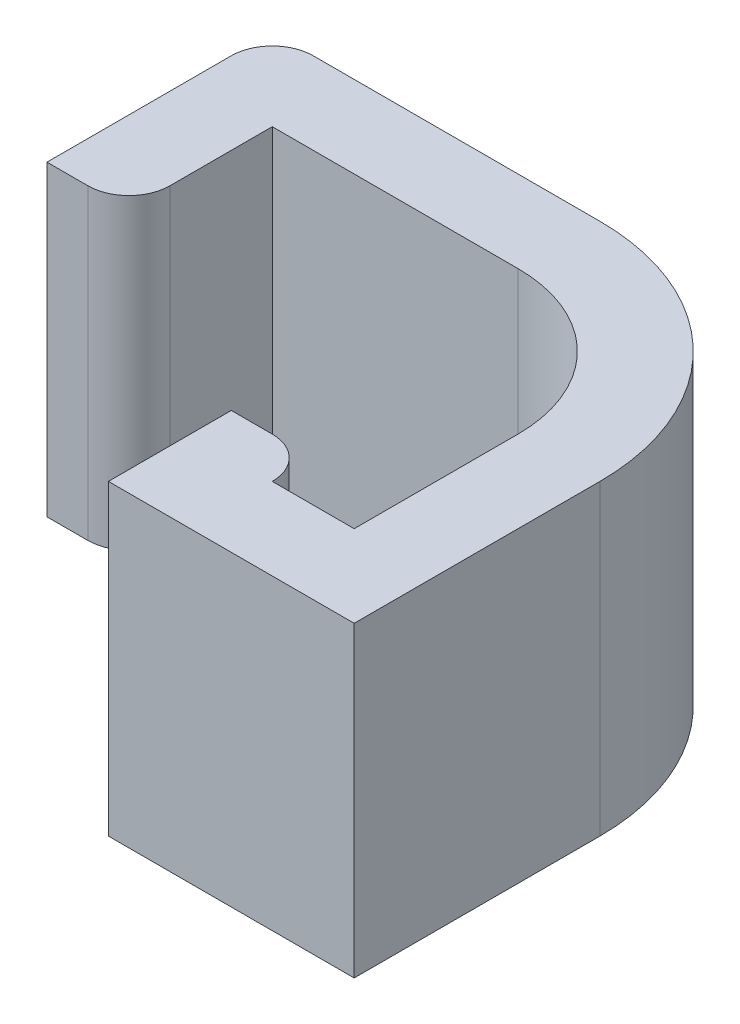
ISO-10303-21;
HEADER;
FILE_DESCRIPTION(('STEP AP214'),'2;1');
FILE_NAME('part.step','',(''),(''),'','','');
FILE_SCHEMA(('AUTOMOTIVE_DESIGN { 1 0 10303 214 1 1 1 1 }'));
ENDSEC;
DATA;
#1=APPLICATION_CONTEXT('core data for automotive mechanical design processes');
#2=APPLICATION_PROTOCOL_DEFINITION('international standard','automotive_design',2000,#1);
#3=PRODUCT_CONTEXT('',#1,'mechanical');
#4=PRODUCT('Part','Part','',(#3));
#5=PRODUCT_RELATED_PRODUCT_CATEGORY('part','',(#4));
#6=PRODUCT_DEFINITION_FORMATION('','',#4);
#7=PRODUCT_DEFINITION_CONTEXT('part definition',#1,'design');
#8=PRODUCT_DEFINITION('design','',#6,#7);
#9=PRODUCT_DEFINITION_SHAPE('','',#8);
#10=(LENGTH_UNIT() NAMED_UNIT(*) SI_UNIT(.MILLI.,.METRE.));
#11=(NAMED_UNIT(*) PLANE_ANGLE_UNIT() SI_UNIT($,.RADIAN.));
#12=(NAMED_UNIT(*) SI_UNIT($,.STERADIAN.) SOLID_ANGLE_UNIT());
#13=UNCERTAINTY_MEASURE_WITH_UNIT(LENGTH_MEASURE(1.E-05),#10,'distance_accuracy_value','');
#14=(GEOMETRIC_REPRESENTATION_CONTEXT(3) GLOBAL_UNCERTAINTY_ASSIGNED_CONTEXT((#13)) GLOBAL_UNIT_ASSIGNED_CONTEXT((#10,
#11,#12)) REPRESENTATION_CONTEXT('',''));
#15=CARTESIAN_POINT('',(0.,0.,0.));
#16=DIRECTION('',(0.,0.,1.));
#17=DIRECTION('',(1.,0.,0.));
#18=AXIS2_PLACEMENT_3D('',#15,#16,#17);
#19=CARTESIAN_POINT('',(0.,15.,0.));
#20=DIRECTION('',(0.,0.,-1.));
#21=DIRECTION('',(-1.,0.,0.));
#22=AXIS2_PLACEMENT_3D('',#19,#20,#21);
#23=PLANE('',#22);
#24=DIRECTION('',(1.,0.,0.));
#25=VECTOR('',#24,1.);
#26=CARTESIAN_POINT('',(0.,0.,0.));
#27=LINE('',#26,#25);
#28=CARTESIAN_POINT('',(-4.,0.,0.));
#29=VERTEX_POINT('',#28);
#30=CARTESIAN_POINT('',(-2.,0.,0.));
#31=VERTEX_POINT('',#30);
#32=EDGE_CURVE('E215',#29,#31,#27,.T.);
#33=ORIENTED_EDGE('',*,*,#32,.T.);
#34=DIRECTION('',(0.,-1.,0.));
#35=VECTOR('',#34,1.);
#36=CARTESIAN_POINT('',(-2.,15.,0.));
#37=LINE('',#36,#35);
#38=CARTESIAN_POINT('',(-2.,15.,0.));
#39=VERTEX_POINT('',#38);
#40=EDGE_CURVE('E314',#31,#39,#37,.F.);
#41=ORIENTED_EDGE('',*,*,#40,.T.);
#42=DIRECTION('',(1.,0.,0.));
#43=VECTOR('',#42,1.);
#44=CARTESIAN_POINT('',(0.,15.,0.));
#45=LINE('',#44,#43);
#46=CARTESIAN_POINT('',(-4.,15.,0.));
#47=VERTEX_POINT('',#46);
#48=EDGE_CURVE('E164',#47,#39,#45,.T.);
#49=ORIENTED_EDGE('',*,*,#48,.F.);
#50=DIRECTION('',(0.,-1.,0.));
#51=VECTOR('',#50,1.);
#52=CARTESIAN_POINT('',(-4.,15.,0.));
#53=LINE('',#52,#51);
#54=EDGE_CURVE('E214',#47,#29,#53,.T.);
#55=ORIENTED_EDGE('',*,*,#54,.T.);
#56=EDGE_LOOP('',(#33,#41,#49,#55));
#57=FACE_BOUND('',#56,.T.);
#58=ADVANCED_FACE('F39',(#57),#23,.F.);
#59=CARTESIAN_POINT('',(0.,15.,0.));
#60=DIRECTION('',(-1.,0.,0.));
#61=DIRECTION('',(0.,0.,1.));
#62=AXIS2_PLACEMENT_3D('',#59,#60,#61);
#63=PLANE('',#62);
#64=DIRECTION('',(0.,0.,-1.));
#65=VECTOR('',#64,1.);
#66=CARTESIAN_POINT('',(0.,15.,0.));
#67=LINE('',#66,#65);
#68=CARTESIAN_POINT('',(0.,15.,-2.));
#69=VERTEX_POINT('',#68);
#70=CARTESIAN_POINT('',(0.,15.,-7.));
#71=VERTEX_POINT('',#70);
#72=EDGE_CURVE('E151',#69,#71,#67,.T.);
#73=ORIENTED_EDGE('',*,*,#72,.F.);
#74=DIRECTION('',(0.,-1.,0.));
#75=VECTOR('',#74,1.);
#76=CARTESIAN_POINT('',(0.,15.,-2.));
#77=LINE('',#76,#75);
#78=CARTESIAN_POINT('',(0.,0.,-2.));
#79=VERTEX_POINT('',#78);
#80=EDGE_CURVE('E311',#69,#79,#77,.T.);
#81=ORIENTED_EDGE('',*,*,#80,.T.);
#82=DIRECTION('',(0.,0.,-1.));
#83=VECTOR('',#82,1.);
#84=CARTESIAN_POINT('',(0.,0.,0.));
#85=LINE('',#84,#83);
#86=CARTESIAN_POINT('',(0.,0.,-7.));
#87=VERTEX_POINT('',#86);
#88=EDGE_CURVE('E170',#79,#87,#85,.T.);
#89=ORIENTED_EDGE('',*,*,#88,.T.);
#90=DIRECTION('',(0.,-1.,0.));
#91=VECTOR('',#90,1.);
#92=CARTESIAN_POINT('',(0.,15.,-7.));
#93=LINE('',#92,#91);
#94=EDGE_CURVE('E167',#71,#87,#93,.T.);
#95=ORIENTED_EDGE('',*,*,#94,.F.);
#96=EDGE_LOOP('',(#73,#81,#89,#95));
#97=FACE_BOUND('',#96,.T.);
#98=ADVANCED_FACE('F168',(#97),#63,.F.);
#99=CARTESIAN_POINT('',(0.,15.,-7.));
#100=DIRECTION('',(0.,0.,-1.));
#101=DIRECTION('',(-1.,0.,0.));
#102=AXIS2_PLACEMENT_3D('',#99,#100,#101);
#103=PLANE('',#102);
#104=DIRECTION('',(1.,0.,0.));
#105=VECTOR('',#104,1.);
#106=CARTESIAN_POINT('',(0.,0.,-7.));
#107=LINE('',#106,#105);
#108=CARTESIAN_POINT('',(12.,0.,-7.));
#109=VERTEX_POINT('',#108);
#110=EDGE_CURVE('E221',#87,#109,#107,.T.);
#111=ORIENTED_EDGE('',*,*,#110,.T.);
#112=DIRECTION('',(0.,-1.,0.));
#113=VECTOR('',#112,1.);
#114=CARTESIAN_POINT('',(12.,15.,-7.));
#115=LINE('',#114,#113);
#116=CARTESIAN_POINT('',(12.,15.,-7.));
#117=VERTEX_POINT('',#116);
#118=EDGE_CURVE('E175',#117,#109,#115,.T.);
#119=ORIENTED_EDGE('',*,*,#118,.F.);
#120=DIRECTION('',(1.,0.,0.));
#121=VECTOR('',#120,1.);
#122=CARTESIAN_POINT('',(0.,15.,-7.));
#123=LINE('',#122,#121);
#124=EDGE_CURVE('E155',#71,#117,#123,.T.);
#125=ORIENTED_EDGE('',*,*,#124,.F.);
#126=ORIENTED_EDGE('',*,*,#94,.T.);
#127=EDGE_LOOP('',(#111,#119,#125,#126));
#128=FACE_BOUND('',#127,.T.);
#129=ADVANCED_FACE('F177',(#128),#103,.F.);
#130=CARTESIAN_POINT('',(12.,15.,0.));
#131=DIRECTION('',(0.,-1.,0.));
#132=DIRECTION('',(0.,0.,-1.));
#133=AXIS2_PLACEMENT_3D('',#130,#131,#132);
#134=CYLINDRICAL_SURFACE('',#133,7.);
#135=CARTESIAN_POINT('',(12.,0.,0.));
#136=DIRECTION('',(0.,-1.,0.));
#137=DIRECTION('',(0.,0.,-1.));
#138=AXIS2_PLACEMENT_3D('',#135,#136,#137);
#139=CIRCLE('',#138,7.);
#140=CARTESIAN_POINT('',(19.,0.,0.));
#141=VERTEX_POINT('',#140);
#142=EDGE_CURVE('E224',#109,#141,#139,.T.);
#143=ORIENTED_EDGE('',*,*,#142,.T.);
#144=DIRECTION('',(0.,-1.,0.));
#145=VECTOR('',#144,1.);
#146=CARTESIAN_POINT('',(19.,15.,0.));
#147=LINE('',#146,#145);
#148=CARTESIAN_POINT('',(19.,15.,0.));
#149=VERTEX_POINT('',#148);
#150=EDGE_CURVE('E286',#149,#141,#147,.T.);
#151=ORIENTED_EDGE('',*,*,#150,.F.);
#152=CARTESIAN_POINT('',(12.,15.,0.));
#153=DIRECTION('',(0.,-1.,0.));
#154=DIRECTION('',(0.,0.,-1.));
#155=AXIS2_PLACEMENT_3D('',#152,#153,#154);
#156=CIRCLE('',#155,7.);
#157=EDGE_CURVE('E181',#117,#149,#156,.T.);
#158=ORIENTED_EDGE('',*,*,#157,.F.);
#159=ORIENTED_EDGE('',*,*,#118,.T.);
#160=EDGE_LOOP('',(#143,#151,#158,#159));
#161=FACE_BOUND('',#160,.T.);
#162=ADVANCED_FACE('F337',(#161),#134,.F.);
#163=CARTESIAN_POINT('',(19.,15.,0.));
#164=DIRECTION('',(1.,0.,0.));
#165=DIRECTION('',(0.,0.,-1.));
#166=AXIS2_PLACEMENT_3D('',#163,#164,#165);
#167=PLANE('',#166);
#168=DIRECTION('',(0.,0.,1.));
#169=VECTOR('',#168,1.);
#170=CARTESIAN_POINT('',(19.,0.,0.));
#171=LINE('',#170,#169);
#172=CARTESIAN_POINT('',(19.,0.,8.));
#173=VERTEX_POINT('',#172);
#174=EDGE_CURVE('E227',#141,#173,#171,.T.);
#175=ORIENTED_EDGE('',*,*,#174,.T.);
#176=DIRECTION('',(0.,-1.,0.));
#177=VECTOR('',#176,1.);
#178=CARTESIAN_POINT('',(19.,15.,8.));
#179=LINE('',#178,#177);
#180=CARTESIAN_POINT('',(19.,15.,8.));
#181=VERTEX_POINT('',#180);
#182=EDGE_CURVE('E282',#181,#173,#179,.T.);
#183=ORIENTED_EDGE('',*,*,#182,.F.);
#184=DIRECTION('',(0.,0.,1.));
#185=VECTOR('',#184,1.);
#186=CARTESIAN_POINT('',(19.,15.,0.));
#187=LINE('',#186,#185);
#188=EDGE_CURVE('E184',#149,#181,#187,.T.);
#189=ORIENTED_EDGE('',*,*,#188,.F.);
#190=ORIENTED_EDGE('',*,*,#150,.T.);
#191=EDGE_LOOP('',(#175,#183,#189,#190));
#192=FACE_BOUND('',#191,.T.);
#193=ADVANCED_FACE('F344',(#192),#167,.F.);
#194=CARTESIAN_POINT('',(19.,15.,8.));
#195=DIRECTION('',(0.,0.,1.));
#196=DIRECTION('',(1.,0.,0.));
#197=AXIS2_PLACEMENT_3D('',#194,#195,#196);
#198=PLANE('',#197);
#199=DIRECTION('',(-1.,0.,0.));
#200=VECTOR('',#199,1.);
#201=CARTESIAN_POINT('',(19.,0.,8.));
#202=LINE('',#201,#200);
#203=CARTESIAN_POINT('',(15.,0.,8.));
#204=VERTEX_POINT('',#203);
#205=EDGE_CURVE('E230',#173,#204,#202,.T.);
#206=ORIENTED_EDGE('',*,*,#205,.T.);
#207=DIRECTION('',(0.,-1.,0.));
#208=VECTOR('',#207,1.);
#209=CARTESIAN_POINT('',(15.,15.,8.));
#210=LINE('',#209,#208);
#211=CARTESIAN_POINT('',(15.,15.,8.));
#212=VERTEX_POINT('',#211);
#213=EDGE_CURVE('E278',#212,#204,#210,.T.);
#214=ORIENTED_EDGE('',*,*,#213,.F.);
#215=DIRECTION('',(-1.,0.,0.));
#216=VECTOR('',#215,1.);
#217=CARTESIAN_POINT('',(19.,15.,8.));
#218=LINE('',#217,#216);
#219=EDGE_CURVE('E190',#181,#212,#218,.T.);
#220=ORIENTED_EDGE('',*,*,#219,.F.);
#221=ORIENTED_EDGE('',*,*,#182,.T.);
#222=EDGE_LOOP('',(#206,#214,#220,#221));
#223=FACE_BOUND('',#222,.T.);
#224=ADVANCED_FACE('F347',(#223),#198,.F.);
#225=CARTESIAN_POINT('',(15.,15.,6.));
#226=DIRECTION('',(0.,0.,1.));
#227=DIRECTION('',(1.,0.,0.));
#228=AXIS2_PLACEMENT_3D('',#225,#226,#227);
#229=PLANE('',#228);
#230=DIRECTION('',(-1.,0.,0.));
#231=VECTOR('',#230,1.);
#232=CARTESIAN_POINT('',(15.,15.,6.));
#233=LINE('',#232,#231);
#234=CARTESIAN_POINT('',(13.,15.,6.));
#235=VERTEX_POINT('',#234);
#236=CARTESIAN_POINT('',(11.,15.,6.));
#237=VERTEX_POINT('',#236);
#238=EDGE_CURVE('E193',#235,#237,#233,.T.);
#239=ORIENTED_EDGE('',*,*,#238,.F.);
#240=DIRECTION('',(0.,-1.,0.));
#241=VECTOR('',#240,1.);
#242=CARTESIAN_POINT('',(13.,15.,6.));
#243=LINE('',#242,#241);
#244=CARTESIAN_POINT('',(13.,0.,6.));
#245=VERTEX_POINT('',#244);
#246=EDGE_CURVE('E174',#235,#245,#243,.T.);
#247=ORIENTED_EDGE('',*,*,#246,.T.);
#248=DIRECTION('',(-1.,0.,0.));
#249=VECTOR('',#248,1.);
#250=CARTESIAN_POINT('',(15.,0.,6.));
#251=LINE('',#250,#249);
#252=CARTESIAN_POINT('',(11.,0.,6.));
#253=VERTEX_POINT('',#252);
#254=EDGE_CURVE('E234',#245,#253,#251,.T.);
#255=ORIENTED_EDGE('',*,*,#254,.T.);
#256=DIRECTION('',(0.,-1.,0.));
#257=VECTOR('',#256,1.);
#258=CARTESIAN_POINT('',(11.,15.,6.));
#259=LINE('',#258,#257);
#260=EDGE_CURVE('E274',#237,#253,#259,.T.);
#261=ORIENTED_EDGE('',*,*,#260,.F.);
#262=EDGE_LOOP('',(#239,#247,#255,#261));
#263=FACE_BOUND('',#262,.T.);
#264=ADVANCED_FACE('F355',(#263),#229,.F.);
#265=CARTESIAN_POINT('',(11.,15.,12.));
#266=DIRECTION('',(1.,0.,0.));
#267=DIRECTION('',(0.,0.,-1.));
#268=AXIS2_PLACEMENT_3D('',#265,#266,#267);
#269=PLANE('',#268);
#270=DIRECTION('',(0.,0.,1.));
#271=VECTOR('',#270,1.);
#272=CARTESIAN_POINT('',(11.,0.,12.));
#273=LINE('',#272,#271);
#274=CARTESIAN_POINT('',(11.,0.,12.));
#275=VERTEX_POINT('',#274);
#276=EDGE_CURVE('E237',#253,#275,#273,.T.);
#277=ORIENTED_EDGE('',*,*,#276,.T.);
#278=DIRECTION('',(0.,-1.,0.));
#279=VECTOR('',#278,1.);
#280=CARTESIAN_POINT('',(11.,15.,12.));
#281=LINE('',#280,#279);
#282=CARTESIAN_POINT('',(11.,15.,12.));
#283=VERTEX_POINT('',#282);
#284=EDGE_CURVE('E270',#283,#275,#281,.T.);
#285=ORIENTED_EDGE('',*,*,#284,.F.);
#286=DIRECTION('',(0.,0.,1.));
#287=VECTOR('',#286,1.);
#288=CARTESIAN_POINT('',(11.,15.,12.));
#289=LINE('',#288,#287);
#290=EDGE_CURVE('E196',#237,#283,#289,.T.);
#291=ORIENTED_EDGE('',*,*,#290,.F.);
#292=ORIENTED_EDGE('',*,*,#260,.T.);
#293=EDGE_LOOP('',(#277,#285,#291,#292));
#294=FACE_BOUND('',#293,.T.);
#295=ADVANCED_FACE('F360',(#294),#269,.F.);
#296=CARTESIAN_POINT('',(23.,15.,12.));
#297=DIRECTION('',(0.,0.,-1.));
#298=DIRECTION('',(-1.,0.,0.));
#299=AXIS2_PLACEMENT_3D('',#296,#297,#298);
#300=PLANE('',#299);
#301=DIRECTION('',(1.,0.,0.));
#302=VECTOR('',#301,1.);
#303=CARTESIAN_POINT('',(23.,0.,12.));
#304=LINE('',#303,#302);
#305=CARTESIAN_POINT('',(23.,0.,12.));
#306=VERTEX_POINT('',#305);
#307=EDGE_CURVE('E240',#275,#306,#304,.T.);
#308=ORIENTED_EDGE('',*,*,#307,.T.);
#309=DIRECTION('',(0.,-1.,0.));
#310=VECTOR('',#309,1.);
#311=CARTESIAN_POINT('',(23.,15.,12.));
#312=LINE('',#311,#310);
#313=CARTESIAN_POINT('',(23.,15.,12.));
#314=VERTEX_POINT('',#313);
#315=EDGE_CURVE('E266',#314,#306,#312,.T.);
#316=ORIENTED_EDGE('',*,*,#315,.F.);
#317=DIRECTION('',(1.,0.,0.));
#318=VECTOR('',#317,1.);
#319=CARTESIAN_POINT('',(23.,15.,12.));
#320=LINE('',#319,#318);
#321=EDGE_CURVE('E199',#283,#314,#320,.T.);
#322=ORIENTED_EDGE('',*,*,#321,.F.);
#323=ORIENTED_EDGE('',*,*,#284,.T.);
#324=EDGE_LOOP('',(#308,#316,#322,#323));
#325=FACE_BOUND('',#324,.T.);
#326=ADVANCED_FACE('F366',(#325),#300,.F.);
#327=CARTESIAN_POINT('',(23.,15.,0.));
#328=DIRECTION('',(-1.,0.,0.));
#329=DIRECTION('',(0.,0.,1.));
#330=AXIS2_PLACEMENT_3D('',#327,#328,#329);
#331=PLANE('',#330);
#332=DIRECTION('',(0.,0.,-1.));
#333=VECTOR('',#332,1.);
#334=CARTESIAN_POINT('',(23.,0.,0.));
#335=LINE('',#334,#333);
#336=CARTESIAN_POINT('',(23.,0.,0.));
#337=VERTEX_POINT('',#336);
#338=EDGE_CURVE('E243',#306,#337,#335,.T.);
#339=ORIENTED_EDGE('',*,*,#338,.T.);
#340=DIRECTION('',(0.,-1.,0.));
#341=VECTOR('',#340,1.);
#342=CARTESIAN_POINT('',(23.,15.,0.));
#343=LINE('',#342,#341);
#344=CARTESIAN_POINT('',(23.,15.,0.));
#345=VERTEX_POINT('',#344);
#346=EDGE_CURVE('E262',#345,#337,#343,.T.);
#347=ORIENTED_EDGE('',*,*,#346,.F.);
#348=DIRECTION('',(0.,0.,-1.));
#349=VECTOR('',#348,1.);
#350=CARTESIAN_POINT('',(23.,15.,0.));
#351=LINE('',#350,#349);
#352=EDGE_CURVE('E202',#314,#345,#351,.T.);
#353=ORIENTED_EDGE('',*,*,#352,.F.);
#354=ORIENTED_EDGE('',*,*,#315,.T.);
#355=EDGE_LOOP('',(#339,#347,#353,#354));
#356=FACE_BOUND('',#355,.T.);
#357=ADVANCED_FACE('F370',(#356),#331,.F.);
#358=CARTESIAN_POINT('',(12.,15.,0.));
#359=DIRECTION('',(0.,-1.,0.));
#360=DIRECTION('',(0.,0.,-1.));
#361=AXIS2_PLACEMENT_3D('',#358,#359,#360);
#362=CYLINDRICAL_SURFACE('',#361,11.);
#363=CARTESIAN_POINT('',(12.,0.,0.));
#364=DIRECTION('',(0.,1.,0.));
#365=DIRECTION('',(0.,0.,-1.));
#366=AXIS2_PLACEMENT_3D('',#363,#364,#365);
#367=CIRCLE('',#366,11.);
#368=CARTESIAN_POINT('',(12.,0.,-11.));
#369=VERTEX_POINT('',#368);
#370=EDGE_CURVE('E246',#337,#369,#367,.T.);
#371=ORIENTED_EDGE('',*,*,#370,.T.);
#372=DIRECTION('',(0.,-1.,0.));
#373=VECTOR('',#372,1.);
#374=CARTESIAN_POINT('',(12.,15.,-11.));
#375=LINE('',#374,#373);
#376=CARTESIAN_POINT('',(12.,15.,-11.));
#377=VERTEX_POINT('',#376);
#378=EDGE_CURVE('E258',#377,#369,#375,.T.);
#379=ORIENTED_EDGE('',*,*,#378,.F.);
#380=CARTESIAN_POINT('',(12.,15.,0.));
#381=DIRECTION('',(0.,1.,0.));
#382=DIRECTION('',(0.,0.,-1.));
#383=AXIS2_PLACEMENT_3D('',#380,#381,#382);
#384=CIRCLE('',#383,11.);
#385=EDGE_CURVE('E205',#345,#377,#384,.T.);
#386=ORIENTED_EDGE('',*,*,#385,.F.);
#387=ORIENTED_EDGE('',*,*,#346,.T.);
#388=EDGE_LOOP('',(#371,#379,#386,#387));
#389=FACE_BOUND('',#388,.T.);
#390=ADVANCED_FACE('F375',(#389),#362,.T.);
#391=CARTESIAN_POINT('',(-4.,15.,-11.));
#392=DIRECTION('',(0.,0.,1.));
#393=DIRECTION('',(1.,0.,0.));
#394=AXIS2_PLACEMENT_3D('',#391,#392,#393);
#395=PLANE('',#394);
#396=DIRECTION('',(-1.,0.,0.));
#397=VECTOR('',#396,1.);
#398=CARTESIAN_POINT('',(-4.,0.,-11.));
#399=LINE('',#398,#397);
#400=CARTESIAN_POINT('',(-2.,0.,-11.));
#401=VERTEX_POINT('',#400);
#402=EDGE_CURVE('E249',#369,#401,#399,.T.);
#403=ORIENTED_EDGE('',*,*,#402,.T.);
#404=DIRECTION('',(0.,-1.,0.));
#405=VECTOR('',#404,1.);
#406=CARTESIAN_POINT('',(-2.,15.,-11.));
#407=LINE('',#406,#405);
#408=CARTESIAN_POINT('',(-2.,15.,-11.));
#409=VERTEX_POINT('',#408);
#410=EDGE_CURVE('E11',#401,#409,#407,.F.);
#411=ORIENTED_EDGE('',*,*,#410,.T.);
#412=DIRECTION('',(-1.,0.,0.));
#413=VECTOR('',#412,1.);
#414=CARTESIAN_POINT('',(-4.,15.,-11.));
#415=LINE('',#414,#413);
#416=EDGE_CURVE('E208',#377,#409,#415,.T.);
#417=ORIENTED_EDGE('',*,*,#416,.F.);
#418=ORIENTED_EDGE('',*,*,#378,.T.);
#419=EDGE_LOOP('',(#403,#411,#417,#418));
#420=FACE_BOUND('',#419,.T.);
#421=ADVANCED_FACE('F400',(#420),#395,.F.);
#422=CARTESIAN_POINT('',(-4.,15.,0.));
#423=DIRECTION('',(1.,0.,0.));
#424=DIRECTION('',(0.,0.,-1.));
#425=AXIS2_PLACEMENT_3D('',#422,#423,#424);
#426=PLANE('',#425);
#427=DIRECTION('',(0.,0.,1.));
#428=VECTOR('',#427,1.);
#429=CARTESIAN_POINT('',(-4.,15.,0.));
#430=LINE('',#429,#428);
#431=CARTESIAN_POINT('',(-4.,15.,-9.));
#432=VERTEX_POINT('',#431);
#433=EDGE_CURVE('E211',#432,#47,#430,.T.);
#434=ORIENTED_EDGE('',*,*,#433,.F.);
#435=DIRECTION('',(0.,-1.,0.));
#436=VECTOR('',#435,1.);
#437=CARTESIAN_POINT('',(-4.,15.,-9.));
#438=LINE('',#437,#436);
#439=CARTESIAN_POINT('',(-4.,0.,-9.));
#440=VERTEX_POINT('',#439);
#441=EDGE_CURVE('E48',#432,#440,#438,.T.);
#442=ORIENTED_EDGE('',*,*,#441,.T.);
#443=DIRECTION('',(0.,0.,1.));
#444=VECTOR('',#443,1.);
#445=CARTESIAN_POINT('',(-4.,0.,0.));
#446=LINE('',#445,#444);
#447=EDGE_CURVE('E252',#440,#29,#446,.T.);
#448=ORIENTED_EDGE('',*,*,#447,.T.);
#449=ORIENTED_EDGE('',*,*,#54,.F.);
#450=EDGE_LOOP('',(#434,#442,#448,#449));
#451=FACE_BOUND('',#450,.T.);
#452=ADVANCED_FACE('F321',(#451),#426,.F.);
#453=CARTESIAN_POINT('',(12.,15.,0.));
#454=DIRECTION('',(0.,-1.,0.));
#455=DIRECTION('',(0.,0.,-1.));
#456=AXIS2_PLACEMENT_3D('',#453,#454,#455);
#457=PLANE('',#456);
#458=ORIENTED_EDGE('',*,*,#219,.T.);
#459=CARTESIAN_POINT('',(13.,15.,8.));
#460=DIRECTION('',(0.,-1.,0.));
#461=DIRECTION('',(0.,0.,-1.));
#462=AXIS2_PLACEMENT_3D('',#459,#460,#461);
#463=CIRCLE('',#462,2.);
#464=EDGE_CURVE('E308',#212,#235,#463,.F.);
#465=ORIENTED_EDGE('',*,*,#464,.T.);
#466=ORIENTED_EDGE('',*,*,#238,.T.);
#467=ORIENTED_EDGE('',*,*,#290,.T.);
#468=ORIENTED_EDGE('',*,*,#321,.T.);
#469=ORIENTED_EDGE('',*,*,#352,.T.);
#470=ORIENTED_EDGE('',*,*,#385,.T.);
#471=ORIENTED_EDGE('',*,*,#416,.T.);
#472=CARTESIAN_POINT('',(-2.,15.,-9.));
#473=DIRECTION('',(0.,-1.,0.));
#474=DIRECTION('',(0.,0.,-1.));
#475=AXIS2_PLACEMENT_3D('',#472,#473,#474);
#476=CIRCLE('',#475,2.);
#477=EDGE_CURVE('E55',#409,#432,#476,.F.);
#478=ORIENTED_EDGE('',*,*,#477,.T.);
#479=ORIENTED_EDGE('',*,*,#433,.T.);
#480=ORIENTED_EDGE('',*,*,#48,.T.);
#481=CARTESIAN_POINT('',(-2.,15.,-2.));
#482=DIRECTION('',(0.,-1.,0.));
#483=DIRECTION('',(0.,0.,-1.));
#484=AXIS2_PLACEMENT_3D('',#481,#482,#483);
#485=CIRCLE('',#484,2.);
#486=EDGE_CURVE('E159',#39,#69,#485,.F.);
#487=ORIENTED_EDGE('',*,*,#486,.T.);
#488=ORIENTED_EDGE('',*,*,#72,.T.);
#489=ORIENTED_EDGE('',*,*,#124,.T.);
#490=ORIENTED_EDGE('',*,*,#157,.T.);
#491=ORIENTED_EDGE('',*,*,#188,.T.);
#492=EDGE_LOOP('',(#458,#465,#466,#467,#468,#469,#470,#471,#478,#479,#480,#487,#488,#489,#490,#491));
#493=FACE_BOUND('',#492,.T.);
#494=ADVANCED_FACE('F153',(#493),#457,.F.);
#495=CARTESIAN_POINT('',(12.,0.,0.));
#496=DIRECTION('',(0.,-1.,0.));
#497=DIRECTION('',(0.,0.,-1.));
#498=AXIS2_PLACEMENT_3D('',#495,#496,#497);
#499=PLANE('',#498);
#500=ORIENTED_EDGE('',*,*,#254,.F.);
#501=CARTESIAN_POINT('',(13.,0.,8.));
#502=DIRECTION('',(0.,-1.,0.));
#503=DIRECTION('',(0.,0.,-1.));
#504=AXIS2_PLACEMENT_3D('',#501,#502,#503);
#505=CIRCLE('',#504,2.);
#506=EDGE_CURVE('E301',#245,#204,#505,.T.);
#507=ORIENTED_EDGE('',*,*,#506,.T.);
#508=ORIENTED_EDGE('',*,*,#205,.F.);
#509=ORIENTED_EDGE('',*,*,#174,.F.);
#510=ORIENTED_EDGE('',*,*,#142,.F.);
#511=ORIENTED_EDGE('',*,*,#110,.F.);
#512=ORIENTED_EDGE('',*,*,#88,.F.);
#513=CARTESIAN_POINT('',(-2.,0.,-2.));
#514=DIRECTION('',(0.,-1.,0.));
#515=DIRECTION('',(0.,0.,-1.));
#516=AXIS2_PLACEMENT_3D('',#513,#514,#515);
#517=CIRCLE('',#516,2.);
#518=EDGE_CURVE('E298',#79,#31,#517,.T.);
#519=ORIENTED_EDGE('',*,*,#518,.T.);
#520=ORIENTED_EDGE('',*,*,#32,.F.);
#521=ORIENTED_EDGE('',*,*,#447,.F.);
#522=CARTESIAN_POINT('',(-2.,0.,-9.));
#523=DIRECTION('',(0.,-1.,0.));
#524=DIRECTION('',(0.,0.,-1.));
#525=AXIS2_PLACEMENT_3D('',#522,#523,#524);
#526=CIRCLE('',#525,2.);
#527=EDGE_CURVE('E295',#440,#401,#526,.T.);
#528=ORIENTED_EDGE('',*,*,#527,.T.);
#529=ORIENTED_EDGE('',*,*,#402,.F.);
#530=ORIENTED_EDGE('',*,*,#370,.F.);
#531=ORIENTED_EDGE('',*,*,#338,.F.);
#532=ORIENTED_EDGE('',*,*,#307,.F.);
#533=ORIENTED_EDGE('',*,*,#276,.F.);
#534=EDGE_LOOP('',(#500,#507,#508,#509,#510,#511,#512,#519,#520,#521,#528,#529,#530,#531,#532,#533));
#535=FACE_BOUND('',#534,.T.);
#536=ADVANCED_FACE('F327',(#535),#499,.T.);
#537=CARTESIAN_POINT('',(13.,15.,8.));
#538=DIRECTION('',(0.,-1.,0.));
#539=DIRECTION('',(0.,0.,-1.));
#540=AXIS2_PLACEMENT_3D('',#537,#538,#539);
#541=CYLINDRICAL_SURFACE('',#540,2.);
#542=ORIENTED_EDGE('',*,*,#464,.F.);
#543=ORIENTED_EDGE('',*,*,#213,.T.);
#544=ORIENTED_EDGE('',*,*,#506,.F.);
#545=ORIENTED_EDGE('',*,*,#246,.F.);
#546=EDGE_LOOP('',(#542,#543,#544,#545));
#547=FACE_BOUND('',#546,.T.);
#548=ADVANCED_FACE('F351',(#547),#541,.T.);
#549=CARTESIAN_POINT('',(-2.,15.,-2.));
#550=DIRECTION('',(0.,-1.,0.));
#551=DIRECTION('',(0.,0.,-1.));
#552=AXIS2_PLACEMENT_3D('',#549,#550,#551);
#553=CYLINDRICAL_SURFACE('',#552,2.);
#554=ORIENTED_EDGE('',*,*,#486,.F.);
#555=ORIENTED_EDGE('',*,*,#40,.F.);
#556=ORIENTED_EDGE('',*,*,#518,.F.);
#557=ORIENTED_EDGE('',*,*,#80,.F.);
#558=EDGE_LOOP('',(#554,#555,#556,#557));
#559=FACE_BOUND('',#558,.T.);
#560=ADVANCED_FACE('F333',(#559),#553,.T.);
#561=CARTESIAN_POINT('',(-2.,15.,-9.));
#562=DIRECTION('',(0.,-1.,0.));
#563=DIRECTION('',(0.,0.,-1.));
#564=AXIS2_PLACEMENT_3D('',#561,#562,#563);
#565=CYLINDRICAL_SURFACE('',#564,2.);
#566=ORIENTED_EDGE('',*,*,#477,.F.);
#567=ORIENTED_EDGE('',*,*,#410,.F.);
#568=ORIENTED_EDGE('',*,*,#527,.F.);
#569=ORIENTED_EDGE('',*,*,#441,.F.);
#570=EDGE_LOOP('',(#566,#567,#568,#569));
#571=FACE_BOUND('',#570,.T.);
#572=ADVANCED_FACE('F41',(#571),#565,.T.);
#573=CLOSED_SHELL('',(#58,#98,#129,#162,#193,#224,#264,#295,#326,#357,#390,#421,#452,#494,#536,
#548,#560,#572));
#574=MANIFOLD_SOLID_BREP('B2',#573);
#575=ADVANCED_BREP_SHAPE_REPRESENTATION('',(#18,#574),#14);
#576=SHAPE_DEFINITION_REPRESENTATION(#9,#575);
ENDSEC;
END-ISO-10303-21;
